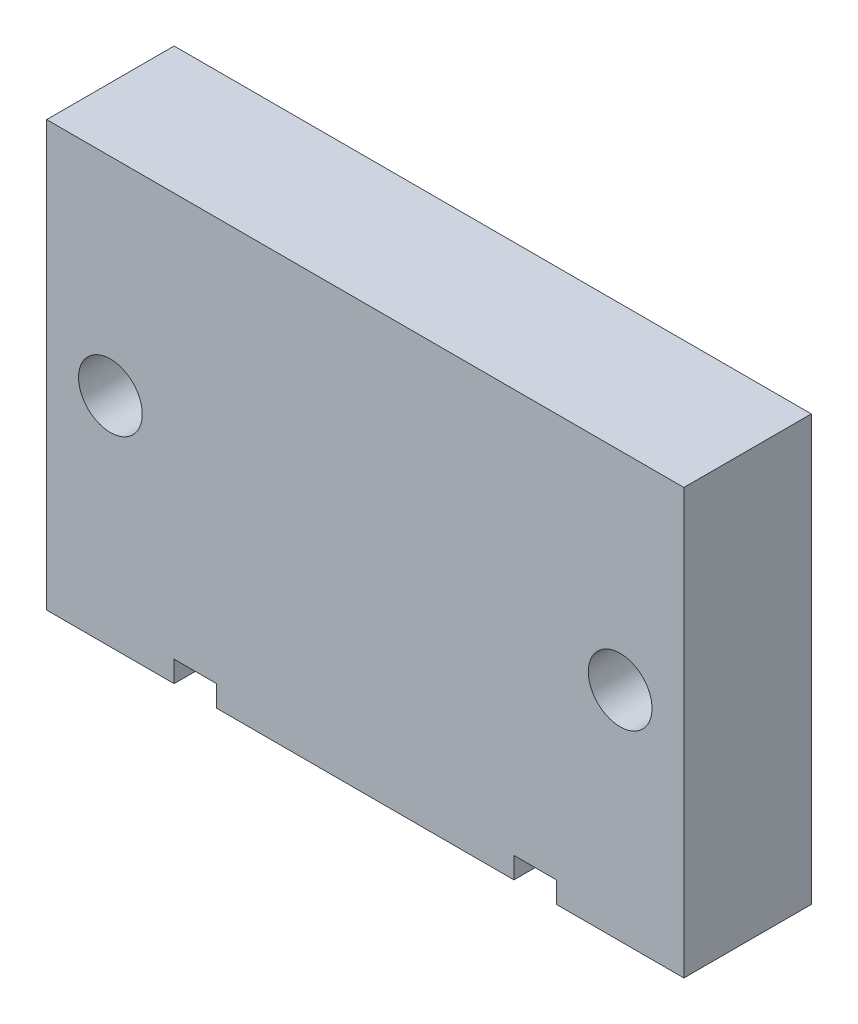
ISO-10303-21;
HEADER;
FILE_DESCRIPTION(('STEP AP214'),'2;1');
FILE_NAME('part.step','',(''),(''),'','','');
FILE_SCHEMA(('AUTOMOTIVE_DESIGN { 1 0 10303 214 1 1 1 1 }'));
ENDSEC;
DATA;
#1=APPLICATION_CONTEXT('core data for automotive mechanical design processes');
#2=APPLICATION_PROTOCOL_DEFINITION('international standard','automotive_design',2000,#1);
#3=PRODUCT_CONTEXT('',#1,'mechanical');
#4=PRODUCT('Part','Part','',(#3));
#5=PRODUCT_RELATED_PRODUCT_CATEGORY('part','',(#4));
#6=PRODUCT_DEFINITION_FORMATION('','',#4);
#7=PRODUCT_DEFINITION_CONTEXT('part definition',#1,'design');
#8=PRODUCT_DEFINITION('design','',#6,#7);
#9=PRODUCT_DEFINITION_SHAPE('','',#8);
#10=(LENGTH_UNIT() NAMED_UNIT(*) SI_UNIT(.MILLI.,.METRE.));
#11=(NAMED_UNIT(*) PLANE_ANGLE_UNIT() SI_UNIT($,.RADIAN.));
#12=(NAMED_UNIT(*) SI_UNIT($,.STERADIAN.) SOLID_ANGLE_UNIT());
#13=UNCERTAINTY_MEASURE_WITH_UNIT(LENGTH_MEASURE(1.E-05),#10,'distance_accuracy_value','');
#14=(GEOMETRIC_REPRESENTATION_CONTEXT(3) GLOBAL_UNCERTAINTY_ASSIGNED_CONTEXT((#13)) GLOBAL_UNIT_ASSIGNED_CONTEXT((#10,
#11,#12)) REPRESENTATION_CONTEXT('',''));
#15=CARTESIAN_POINT('',(0.,0.,0.));
#16=DIRECTION('',(0.,0.,1.));
#17=DIRECTION('',(1.,0.,0.));
#18=AXIS2_PLACEMENT_3D('',#15,#16,#17);
#19=CARTESIAN_POINT('',(-7.5,0.,1.5));
#20=DIRECTION('',(0.,1.,0.));
#21=DIRECTION('',(0.,0.,1.));
#22=AXIS2_PLACEMENT_3D('',#19,#20,#21);
#23=PLANE('',#22);
#24=DIRECTION('',(0.,0.,1.));
#25=VECTOR('',#24,1.);
#26=CARTESIAN_POINT('',(-3.5,0.,1.5));
#27=LINE('',#26,#25);
#28=CARTESIAN_POINT('',(-3.5,0.,-1.5));
#29=VERTEX_POINT('',#28);
#30=CARTESIAN_POINT('',(-3.5,0.,1.5));
#31=VERTEX_POINT('',#30);
#32=EDGE_CURVE('E176',#29,#31,#27,.T.);
#33=ORIENTED_EDGE('',*,*,#32,.F.);
#34=DIRECTION('',(1.,0.,0.));
#35=VECTOR('',#34,1.);
#36=CARTESIAN_POINT('',(-7.5,0.,-1.5));
#37=LINE('',#36,#35);
#38=CARTESIAN_POINT('',(3.5,0.,-1.5));
#39=VERTEX_POINT('',#38);
#40=EDGE_CURVE('E341',#29,#39,#37,.T.);
#41=ORIENTED_EDGE('',*,*,#40,.T.);
#42=DIRECTION('',(0.,0.,-1.));
#43=VECTOR('',#42,1.);
#44=CARTESIAN_POINT('',(3.5,0.,1.5));
#45=LINE('',#44,#43);
#46=CARTESIAN_POINT('',(3.5,0.,1.5));
#47=VERTEX_POINT('',#46);
#48=EDGE_CURVE('E234',#47,#39,#45,.T.);
#49=ORIENTED_EDGE('',*,*,#48,.F.);
#50=DIRECTION('',(1.,0.,0.));
#51=VECTOR('',#50,1.);
#52=CARTESIAN_POINT('',(-7.5,0.,1.5));
#53=LINE('',#52,#51);
#54=EDGE_CURVE('E329',#31,#47,#53,.T.);
#55=ORIENTED_EDGE('',*,*,#54,.F.);
#56=EDGE_LOOP('',(#33,#41,#49,#55));
#57=FACE_BOUND('',#56,.T.);
#58=ADVANCED_FACE('F42',(#57),#23,.F.);
#59=DIRECTION('',(0.,0.,-1.));
#60=VECTOR('',#59,1.);
#61=CARTESIAN_POINT('',(-4.5,0.,1.5));
#62=LINE('',#61,#60);
#63=CARTESIAN_POINT('',(-4.5,0.,1.5));
#64=VERTEX_POINT('',#63);
#65=CARTESIAN_POINT('',(-4.5,0.,-1.5));
#66=VERTEX_POINT('',#65);
#67=EDGE_CURVE('E194',#64,#66,#62,.T.);
#68=ORIENTED_EDGE('',*,*,#67,.F.);
#69=CARTESIAN_POINT('',(-7.5,0.,1.5));
#70=VERTEX_POINT('',#69);
#71=EDGE_CURVE('E321',#70,#64,#53,.T.);
#72=ORIENTED_EDGE('',*,*,#71,.F.);
#73=DIRECTION('',(0.,0.,-1.));
#74=VECTOR('',#73,1.);
#75=CARTESIAN_POINT('',(-7.5,0.,1.5));
#76=LINE('',#75,#74);
#77=CARTESIAN_POINT('',(-7.5,0.,-1.5));
#78=VERTEX_POINT('',#77);
#79=EDGE_CURVE('E11',#70,#78,#76,.T.);
#80=ORIENTED_EDGE('',*,*,#79,.T.);
#81=EDGE_CURVE('E340',#78,#66,#37,.T.);
#82=ORIENTED_EDGE('',*,*,#81,.T.);
#83=EDGE_LOOP('',(#68,#72,#80,#82));
#84=FACE_BOUND('',#83,.T.);
#85=ADVANCED_FACE('F392',(#84),#23,.F.);
#86=DIRECTION('',(0.,0.,1.));
#87=VECTOR('',#86,1.);
#88=CARTESIAN_POINT('',(4.5,0.,1.5));
#89=LINE('',#88,#87);
#90=CARTESIAN_POINT('',(4.5,0.,-1.5));
#91=VERTEX_POINT('',#90);
#92=CARTESIAN_POINT('',(4.5,0.,1.5));
#93=VERTEX_POINT('',#92);
#94=EDGE_CURVE('E202',#91,#93,#89,.T.);
#95=ORIENTED_EDGE('',*,*,#94,.F.);
#96=CARTESIAN_POINT('',(7.5,0.,-1.5));
#97=VERTEX_POINT('',#96);
#98=EDGE_CURVE('E337',#91,#97,#37,.T.);
#99=ORIENTED_EDGE('',*,*,#98,.T.);
#100=DIRECTION('',(0.,0.,-1.));
#101=VECTOR('',#100,1.);
#102=CARTESIAN_POINT('',(7.5,0.,1.5));
#103=LINE('',#102,#101);
#104=CARTESIAN_POINT('',(7.5,0.,1.5));
#105=VERTEX_POINT('',#104);
#106=EDGE_CURVE('E52',#105,#97,#103,.T.);
#107=ORIENTED_EDGE('',*,*,#106,.F.);
#108=EDGE_CURVE('E318',#93,#105,#53,.T.);
#109=ORIENTED_EDGE('',*,*,#108,.F.);
#110=EDGE_LOOP('',(#95,#99,#107,#109));
#111=FACE_BOUND('',#110,.T.);
#112=ADVANCED_FACE('F394',(#111),#23,.F.);
#113=CARTESIAN_POINT('',(0.,0.,-1.5));
#114=DIRECTION('',(0.,0.,-1.));
#115=DIRECTION('',(-1.,0.,0.));
#116=AXIS2_PLACEMENT_3D('',#113,#114,#115);
#117=PLANE('',#116);
#118=CARTESIAN_POINT('',(6.,5.12,-1.5));
#119=DIRECTION('',(0.,0.,-1.));
#120=DIRECTION('',(-1.,0.,0.));
#121=AXIS2_PLACEMENT_3D('',#118,#119,#120);
#122=CIRCLE('',#121,0.749999999999998);
#123=CARTESIAN_POINT('',(5.25,5.12,-1.5));
#124=VERTEX_POINT('',#123);
#125=EDGE_CURVE('E560',#124,#124,#122,.T.);
#126=ORIENTED_EDGE('',*,*,#125,.F.);
#127=EDGE_LOOP('',(#126));
#128=FACE_BOUND('',#127,.T.);
#129=CARTESIAN_POINT('',(-6.,5.12,-1.5));
#130=DIRECTION('',(0.,0.,-1.));
#131=DIRECTION('',(-1.,0.,0.));
#132=AXIS2_PLACEMENT_3D('',#129,#130,#131);
#133=CIRCLE('',#132,0.749999999999998);
#134=CARTESIAN_POINT('',(-6.75,5.12,-1.5));
#135=VERTEX_POINT('',#134);
#136=EDGE_CURVE('E559',#135,#135,#133,.T.);
#137=ORIENTED_EDGE('',*,*,#136,.F.);
#138=EDGE_LOOP('',(#137));
#139=FACE_BOUND('',#138,.T.);
#140=DIRECTION('',(0.5,0.866025403784438,0.));
#141=VECTOR('',#140,1.);
#142=CARTESIAN_POINT('',(1.64544826719043,2.27,-1.5));
#143=LINE('',#142,#141);
#144=CARTESIAN_POINT('',(1.64544826719043,2.27,-1.5));
#145=VERTEX_POINT('',#144);
#146=CARTESIAN_POINT('',(3.29089653438087,5.12,-1.5));
#147=VERTEX_POINT('',#146);
#148=EDGE_CURVE('E271',#145,#147,#143,.T.);
#149=ORIENTED_EDGE('',*,*,#148,.T.);
#150=DIRECTION('',(-0.5,0.866025403784439,0.));
#151=VECTOR('',#150,1.);
#152=CARTESIAN_POINT('',(3.29089653438087,5.12,-1.5));
#153=LINE('',#152,#151);
#154=CARTESIAN_POINT('',(1.64544826719043,7.97,-1.5));
#155=VERTEX_POINT('',#154);
#156=EDGE_CURVE('E276',#147,#155,#153,.T.);
#157=ORIENTED_EDGE('',*,*,#156,.T.);
#158=DIRECTION('',(-1.,0.,0.));
#159=VECTOR('',#158,1.);
#160=CARTESIAN_POINT('',(1.64544826719043,7.97,-1.5));
#161=LINE('',#160,#159);
#162=CARTESIAN_POINT('',(-1.64544826719043,7.97,-1.5));
#163=VERTEX_POINT('',#162);
#164=EDGE_CURVE('E284',#155,#163,#161,.T.);
#165=ORIENTED_EDGE('',*,*,#164,.T.);
#166=DIRECTION('',(-0.5,-0.866025403784439,0.));
#167=VECTOR('',#166,1.);
#168=CARTESIAN_POINT('',(-1.64544826719043,7.97,-1.5));
#169=LINE('',#168,#167);
#170=CARTESIAN_POINT('',(-3.29089653438087,5.12,-1.5));
#171=VERTEX_POINT('',#170);
#172=EDGE_CURVE('E282',#163,#171,#169,.T.);
#173=ORIENTED_EDGE('',*,*,#172,.T.);
#174=DIRECTION('',(0.5,-0.866025403784439,0.));
#175=VECTOR('',#174,1.);
#176=CARTESIAN_POINT('',(-3.29089653438087,5.12,-1.5));
#177=LINE('',#176,#175);
#178=CARTESIAN_POINT('',(-1.64544826719043,2.27,-1.5));
#179=VERTEX_POINT('',#178);
#180=EDGE_CURVE('E288',#171,#179,#177,.T.);
#181=ORIENTED_EDGE('',*,*,#180,.T.);
#182=DIRECTION('',(1.,0.,0.));
#183=VECTOR('',#182,1.);
#184=CARTESIAN_POINT('',(-1.64544826719043,2.27,-1.5));
#185=LINE('',#184,#183);
#186=EDGE_CURVE('E291',#179,#145,#185,.T.);
#187=ORIENTED_EDGE('',*,*,#186,.T.);
#188=EDGE_LOOP('',(#149,#157,#165,#173,#181,#187));
#189=FACE_BOUND('',#188,.T.);
#190=DIRECTION('',(1.,0.,0.));
#191=VECTOR('',#190,1.);
#192=CARTESIAN_POINT('',(-3.5,0.5,-1.5));
#193=LINE('',#192,#191);
#194=CARTESIAN_POINT('',(-4.5,0.5,-1.5));
#195=VERTEX_POINT('',#194);
#196=CARTESIAN_POINT('',(-3.5,0.5,-1.5));
#197=VERTEX_POINT('',#196);
#198=EDGE_CURVE('E182',#195,#197,#193,.T.);
#199=ORIENTED_EDGE('',*,*,#198,.F.);
#200=DIRECTION('',(0.,-1.,0.));
#201=VECTOR('',#200,1.);
#202=CARTESIAN_POINT('',(-4.5,0.5,-1.5));
#203=LINE('',#202,#201);
#204=EDGE_CURVE('E211',#195,#66,#203,.T.);
#205=ORIENTED_EDGE('',*,*,#204,.T.);
#206=ORIENTED_EDGE('',*,*,#81,.F.);
#207=DIRECTION('',(0.,-1.,0.));
#208=VECTOR('',#207,1.);
#209=CARTESIAN_POINT('',(-7.5,0.,-1.5));
#210=LINE('',#209,#208);
#211=CARTESIAN_POINT('',(-7.5,10.,-1.5));
#212=VERTEX_POINT('',#211);
#213=EDGE_CURVE('E301',#212,#78,#210,.T.);
#214=ORIENTED_EDGE('',*,*,#213,.F.);
#215=DIRECTION('',(-1.,0.,0.));
#216=VECTOR('',#215,1.);
#217=CARTESIAN_POINT('',(-7.5,10.,-1.5));
#218=LINE('',#217,#216);
#219=CARTESIAN_POINT('',(7.5,10.,-1.5));
#220=VERTEX_POINT('',#219);
#221=EDGE_CURVE('E324',#220,#212,#218,.T.);
#222=ORIENTED_EDGE('',*,*,#221,.F.);
#223=DIRECTION('',(0.,1.,0.));
#224=VECTOR('',#223,1.);
#225=CARTESIAN_POINT('',(7.5,0.,-1.5));
#226=LINE('',#225,#224);
#227=EDGE_CURVE('E344',#97,#220,#226,.T.);
#228=ORIENTED_EDGE('',*,*,#227,.F.);
#229=ORIENTED_EDGE('',*,*,#98,.F.);
#230=DIRECTION('',(0.,-1.,0.));
#231=VECTOR('',#230,1.);
#232=CARTESIAN_POINT('',(4.5,0.5,-1.5));
#233=LINE('',#232,#231);
#234=CARTESIAN_POINT('',(4.5,0.5,-1.5));
#235=VERTEX_POINT('',#234);
#236=EDGE_CURVE('E229',#235,#91,#233,.T.);
#237=ORIENTED_EDGE('',*,*,#236,.F.);
#238=DIRECTION('',(1.,0.,0.));
#239=VECTOR('',#238,1.);
#240=CARTESIAN_POINT('',(4.5,0.5,-1.5));
#241=LINE('',#240,#239);
#242=CARTESIAN_POINT('',(3.5,0.5,-1.5));
#243=VERTEX_POINT('',#242);
#244=EDGE_CURVE('E221',#243,#235,#241,.T.);
#245=ORIENTED_EDGE('',*,*,#244,.F.);
#246=DIRECTION('',(0.,-1.,0.));
#247=VECTOR('',#246,1.);
#248=CARTESIAN_POINT('',(3.5,0.5,-1.5));
#249=LINE('',#248,#247);
#250=EDGE_CURVE('E228',#243,#39,#249,.T.);
#251=ORIENTED_EDGE('',*,*,#250,.T.);
#252=ORIENTED_EDGE('',*,*,#40,.F.);
#253=DIRECTION('',(0.,-1.,0.));
#254=VECTOR('',#253,1.);
#255=CARTESIAN_POINT('',(-3.5,0.5,-1.5));
#256=LINE('',#255,#254);
#257=EDGE_CURVE('E206',#197,#29,#256,.T.);
#258=ORIENTED_EDGE('',*,*,#257,.F.);
#259=EDGE_LOOP('',(#199,#205,#206,#214,#222,#228,#229,#237,#245,#251,#252,#258));
#260=FACE_BOUND('',#259,.T.);
#261=ADVANCED_FACE('F366',(#128,#139,#189,#260),#117,.T.);
#262=CARTESIAN_POINT('',(-7.5,0.,1.5));
#263=DIRECTION('',(1.,0.,0.));
#264=DIRECTION('',(0.,0.,-1.));
#265=AXIS2_PLACEMENT_3D('',#262,#263,#264);
#266=PLANE('',#265);
#267=ORIENTED_EDGE('',*,*,#213,.T.);
#268=ORIENTED_EDGE('',*,*,#79,.F.);
#269=DIRECTION('',(0.,-1.,0.));
#270=VECTOR('',#269,1.);
#271=CARTESIAN_POINT('',(-7.5,0.,1.5));
#272=LINE('',#271,#270);
#273=CARTESIAN_POINT('',(-7.5,10.,1.5));
#274=VERTEX_POINT('',#273);
#275=EDGE_CURVE('E317',#274,#70,#272,.T.);
#276=ORIENTED_EDGE('',*,*,#275,.F.);
#277=DIRECTION('',(0.,0.,-1.));
#278=VECTOR('',#277,1.);
#279=CARTESIAN_POINT('',(-7.5,10.,1.5));
#280=LINE('',#279,#278);
#281=EDGE_CURVE('E331',#274,#212,#280,.T.);
#282=ORIENTED_EDGE('',*,*,#281,.T.);
#283=EDGE_LOOP('',(#267,#268,#276,#282));
#284=FACE_BOUND('',#283,.T.);
#285=ADVANCED_FACE('F46',(#284),#266,.F.);
#286=CARTESIAN_POINT('',(7.5,0.,1.5));
#287=DIRECTION('',(-1.,0.,0.));
#288=DIRECTION('',(0.,0.,1.));
#289=AXIS2_PLACEMENT_3D('',#286,#287,#288);
#290=PLANE('',#289);
#291=ORIENTED_EDGE('',*,*,#227,.T.);
#292=DIRECTION('',(0.,0.,-1.));
#293=VECTOR('',#292,1.);
#294=CARTESIAN_POINT('',(7.5,10.,1.5));
#295=LINE('',#294,#293);
#296=CARTESIAN_POINT('',(7.5,10.,1.5));
#297=VERTEX_POINT('',#296);
#298=EDGE_CURVE('E347',#297,#220,#295,.T.);
#299=ORIENTED_EDGE('',*,*,#298,.F.);
#300=DIRECTION('',(0.,1.,0.));
#301=VECTOR('',#300,1.);
#302=CARTESIAN_POINT('',(7.5,0.,1.5));
#303=LINE('',#302,#301);
#304=EDGE_CURVE('E322',#105,#297,#303,.T.);
#305=ORIENTED_EDGE('',*,*,#304,.F.);
#306=ORIENTED_EDGE('',*,*,#106,.T.);
#307=EDGE_LOOP('',(#291,#299,#305,#306));
#308=FACE_BOUND('',#307,.T.);
#309=ADVANCED_FACE('F360',(#308),#290,.F.);
#310=CARTESIAN_POINT('',(-7.5,10.,1.5));
#311=DIRECTION('',(0.,-1.,0.));
#312=DIRECTION('',(0.,0.,-1.));
#313=AXIS2_PLACEMENT_3D('',#310,#311,#312);
#314=PLANE('',#313);
#315=ORIENTED_EDGE('',*,*,#221,.T.);
#316=ORIENTED_EDGE('',*,*,#281,.F.);
#317=DIRECTION('',(-1.,0.,0.));
#318=VECTOR('',#317,1.);
#319=CARTESIAN_POINT('',(-7.5,10.,1.5));
#320=LINE('',#319,#318);
#321=EDGE_CURVE('E328',#297,#274,#320,.T.);
#322=ORIENTED_EDGE('',*,*,#321,.F.);
#323=ORIENTED_EDGE('',*,*,#298,.T.);
#324=EDGE_LOOP('',(#315,#316,#322,#323));
#325=FACE_BOUND('',#324,.T.);
#326=ADVANCED_FACE('F371',(#325),#314,.F.);
#327=CARTESIAN_POINT('',(0.,0.,1.5));
#328=DIRECTION('',(0.,0.,-1.));
#329=DIRECTION('',(-1.,0.,0.));
#330=AXIS2_PLACEMENT_3D('',#327,#328,#329);
#331=PLANE('',#330);
#332=CARTESIAN_POINT('',(6.,5.12,1.5));
#333=DIRECTION('',(0.,0.,-1.));
#334=DIRECTION('',(-1.,0.,0.));
#335=AXIS2_PLACEMENT_3D('',#332,#333,#334);
#336=CIRCLE('',#335,0.749999999999998);
#337=CARTESIAN_POINT('',(5.25,5.12,1.5));
#338=VERTEX_POINT('',#337);
#339=EDGE_CURVE('E231',#338,#338,#336,.T.);
#340=ORIENTED_EDGE('',*,*,#339,.T.);
#341=EDGE_LOOP('',(#340));
#342=FACE_BOUND('',#341,.T.);
#343=CARTESIAN_POINT('',(-6.,5.12,1.5));
#344=DIRECTION('',(0.,0.,-1.));
#345=DIRECTION('',(-1.,0.,0.));
#346=AXIS2_PLACEMENT_3D('',#343,#344,#345);
#347=CIRCLE('',#346,0.749999999999998);
#348=CARTESIAN_POINT('',(-6.75,5.12,1.5));
#349=VERTEX_POINT('',#348);
#350=EDGE_CURVE('E564',#349,#349,#347,.T.);
#351=ORIENTED_EDGE('',*,*,#350,.T.);
#352=EDGE_LOOP('',(#351));
#353=FACE_BOUND('',#352,.T.);
#354=DIRECTION('',(-1.,0.,0.));
#355=VECTOR('',#354,1.);
#356=CARTESIAN_POINT('',(-3.5,0.5,1.5));
#357=LINE('',#356,#355);
#358=CARTESIAN_POINT('',(-3.5,0.5,1.5));
#359=VERTEX_POINT('',#358);
#360=CARTESIAN_POINT('',(-4.5,0.5,1.5));
#361=VERTEX_POINT('',#360);
#362=EDGE_CURVE('E187',#359,#361,#357,.T.);
#363=ORIENTED_EDGE('',*,*,#362,.F.);
#364=DIRECTION('',(0.,-1.,0.));
#365=VECTOR('',#364,1.);
#366=CARTESIAN_POINT('',(-3.5,0.5,1.5));
#367=LINE('',#366,#365);
#368=EDGE_CURVE('E171',#359,#31,#367,.T.);
#369=ORIENTED_EDGE('',*,*,#368,.T.);
#370=ORIENTED_EDGE('',*,*,#54,.T.);
#371=DIRECTION('',(0.,-1.,0.));
#372=VECTOR('',#371,1.);
#373=CARTESIAN_POINT('',(3.5,0.5,1.5));
#374=LINE('',#373,#372);
#375=CARTESIAN_POINT('',(3.5,0.5,1.5));
#376=VERTEX_POINT('',#375);
#377=EDGE_CURVE('E225',#376,#47,#374,.T.);
#378=ORIENTED_EDGE('',*,*,#377,.F.);
#379=DIRECTION('',(-1.,0.,0.));
#380=VECTOR('',#379,1.);
#381=CARTESIAN_POINT('',(4.5,0.5,1.5));
#382=LINE('',#381,#380);
#383=CARTESIAN_POINT('',(4.5,0.5,1.5));
#384=VERTEX_POINT('',#383);
#385=EDGE_CURVE('E242',#384,#376,#382,.T.);
#386=ORIENTED_EDGE('',*,*,#385,.F.);
#387=DIRECTION('',(0.,-1.,0.));
#388=VECTOR('',#387,1.);
#389=CARTESIAN_POINT('',(4.5,0.5,1.5));
#390=LINE('',#389,#388);
#391=EDGE_CURVE('E220',#384,#93,#390,.T.);
#392=ORIENTED_EDGE('',*,*,#391,.T.);
#393=ORIENTED_EDGE('',*,*,#108,.T.);
#394=ORIENTED_EDGE('',*,*,#304,.T.);
#395=ORIENTED_EDGE('',*,*,#321,.T.);
#396=ORIENTED_EDGE('',*,*,#275,.T.);
#397=ORIENTED_EDGE('',*,*,#71,.T.);
#398=DIRECTION('',(0.,-1.,0.));
#399=VECTOR('',#398,1.);
#400=CARTESIAN_POINT('',(-4.5,0.5,1.5));
#401=LINE('',#400,#399);
#402=EDGE_CURVE('E185',#361,#64,#401,.T.);
#403=ORIENTED_EDGE('',*,*,#402,.F.);
#404=EDGE_LOOP('',(#363,#369,#370,#378,#386,#392,#393,#394,#395,#396,#397,#403));
#405=FACE_BOUND('',#404,.T.);
#406=ADVANCED_FACE('F195',(#342,#353,#405),#331,.F.);
#407=CARTESIAN_POINT('',(1.64544826719043,2.27,-1.5));
#408=DIRECTION('',(0.866025403784439,-0.5,0.));
#409=DIRECTION('',(0.5,0.866025403784439,0.));
#410=AXIS2_PLACEMENT_3D('',#407,#408,#409);
#411=PLANE('',#410);
#412=DIRECTION('',(0.,0.,1.));
#413=VECTOR('',#412,1.);
#414=CARTESIAN_POINT('',(3.29089653438087,5.12,-1.5));
#415=LINE('',#414,#413);
#416=CARTESIAN_POINT('',(3.29089653438087,5.12,1.));
#417=VERTEX_POINT('',#416);
#418=EDGE_CURVE('E300',#147,#417,#415,.T.);
#419=ORIENTED_EDGE('',*,*,#418,.F.);
#420=ORIENTED_EDGE('',*,*,#148,.F.);
#421=DIRECTION('',(0.,0.,1.));
#422=VECTOR('',#421,1.);
#423=CARTESIAN_POINT('',(1.64544826719043,2.27,-1.5));
#424=LINE('',#423,#422);
#425=CARTESIAN_POINT('',(1.64544826719043,2.27,1.));
#426=VERTEX_POINT('',#425);
#427=EDGE_CURVE('E296',#145,#426,#424,.T.);
#428=ORIENTED_EDGE('',*,*,#427,.T.);
#429=DIRECTION('',(0.5,0.866025403784438,0.));
#430=VECTOR('',#429,1.);
#431=CARTESIAN_POINT('',(1.64544826719043,2.27,1.));
#432=LINE('',#431,#430);
#433=EDGE_CURVE('E214',#426,#417,#432,.T.);
#434=ORIENTED_EDGE('',*,*,#433,.T.);
#435=EDGE_LOOP('',(#419,#420,#428,#434));
#436=FACE_BOUND('',#435,.T.);
#437=ADVANCED_FACE('F487',(#436),#411,.F.);
#438=CARTESIAN_POINT('',(-1.64544826719043,2.27,-1.5));
#439=DIRECTION('',(0.,-1.,0.));
#440=DIRECTION('',(0.,0.,-1.));
#441=AXIS2_PLACEMENT_3D('',#438,#439,#440);
#442=PLANE('',#441);
#443=ORIENTED_EDGE('',*,*,#427,.F.);
#444=ORIENTED_EDGE('',*,*,#186,.F.);
#445=DIRECTION('',(0.,0.,1.));
#446=VECTOR('',#445,1.);
#447=CARTESIAN_POINT('',(-1.64544826719043,2.27,-1.5));
#448=LINE('',#447,#446);
#449=CARTESIAN_POINT('',(-1.64544826719043,2.27,1.));
#450=VERTEX_POINT('',#449);
#451=EDGE_CURVE('E305',#179,#450,#448,.T.);
#452=ORIENTED_EDGE('',*,*,#451,.T.);
#453=DIRECTION('',(1.,0.,0.));
#454=VECTOR('',#453,1.);
#455=CARTESIAN_POINT('',(-1.64544826719043,2.27,1.));
#456=LINE('',#455,#454);
#457=EDGE_CURVE('E268',#450,#426,#456,.T.);
#458=ORIENTED_EDGE('',*,*,#457,.T.);
#459=EDGE_LOOP('',(#443,#444,#452,#458));
#460=FACE_BOUND('',#459,.T.);
#461=ADVANCED_FACE('F476',(#460),#442,.F.);
#462=CARTESIAN_POINT('',(-3.29089653438087,5.12,-1.5));
#463=DIRECTION('',(-0.866025403784439,-0.5,0.));
#464=DIRECTION('',(0.5,-0.866025403784439,0.));
#465=AXIS2_PLACEMENT_3D('',#462,#463,#464);
#466=PLANE('',#465);
#467=ORIENTED_EDGE('',*,*,#451,.F.);
#468=ORIENTED_EDGE('',*,*,#180,.F.);
#469=DIRECTION('',(0.,0.,1.));
#470=VECTOR('',#469,1.);
#471=CARTESIAN_POINT('',(-3.29089653438087,5.12,-1.5));
#472=LINE('',#471,#470);
#473=CARTESIAN_POINT('',(-3.29089653438087,5.12,1.));
#474=VERTEX_POINT('',#473);
#475=EDGE_CURVE('E304',#171,#474,#472,.T.);
#476=ORIENTED_EDGE('',*,*,#475,.T.);
#477=DIRECTION('',(0.5,-0.866025403784439,0.));
#478=VECTOR('',#477,1.);
#479=CARTESIAN_POINT('',(-3.29089653438087,5.12,1.));
#480=LINE('',#479,#478);
#481=EDGE_CURVE('E262',#474,#450,#480,.T.);
#482=ORIENTED_EDGE('',*,*,#481,.T.);
#483=EDGE_LOOP('',(#467,#468,#476,#482));
#484=FACE_BOUND('',#483,.T.);
#485=ADVANCED_FACE('F470',(#484),#466,.F.);
#486=CARTESIAN_POINT('',(-1.64544826719043,7.97,-1.5));
#487=DIRECTION('',(-0.866025403784439,0.5,0.));
#488=DIRECTION('',(-0.5,-0.866025403784439,0.));
#489=AXIS2_PLACEMENT_3D('',#486,#487,#488);
#490=PLANE('',#489);
#491=ORIENTED_EDGE('',*,*,#475,.F.);
#492=ORIENTED_EDGE('',*,*,#172,.F.);
#493=DIRECTION('',(0.,0.,1.));
#494=VECTOR('',#493,1.);
#495=CARTESIAN_POINT('',(-1.64544826719043,7.97,-1.5));
#496=LINE('',#495,#494);
#497=CARTESIAN_POINT('',(-1.64544826719043,7.97,1.));
#498=VERTEX_POINT('',#497);
#499=EDGE_CURVE('E308',#163,#498,#496,.T.);
#500=ORIENTED_EDGE('',*,*,#499,.T.);
#501=DIRECTION('',(-0.5,-0.866025403784439,0.));
#502=VECTOR('',#501,1.);
#503=CARTESIAN_POINT('',(-1.64544826719043,7.97,1.));
#504=LINE('',#503,#502);
#505=EDGE_CURVE('E264',#498,#474,#504,.T.);
#506=ORIENTED_EDGE('',*,*,#505,.T.);
#507=EDGE_LOOP('',(#491,#492,#500,#506));
#508=FACE_BOUND('',#507,.T.);
#509=ADVANCED_FACE('F456',(#508),#490,.F.);
#510=CARTESIAN_POINT('',(1.64544826719043,7.97,-1.5));
#511=DIRECTION('',(0.,1.,0.));
#512=DIRECTION('',(0.,0.,1.));
#513=AXIS2_PLACEMENT_3D('',#510,#511,#512);
#514=PLANE('',#513);
#515=ORIENTED_EDGE('',*,*,#499,.F.);
#516=ORIENTED_EDGE('',*,*,#164,.F.);
#517=DIRECTION('',(0.,0.,1.));
#518=VECTOR('',#517,1.);
#519=CARTESIAN_POINT('',(1.64544826719043,7.97,-1.5));
#520=LINE('',#519,#518);
#521=CARTESIAN_POINT('',(1.64544826719043,7.97,1.));
#522=VERTEX_POINT('',#521);
#523=EDGE_CURVE('E311',#155,#522,#520,.T.);
#524=ORIENTED_EDGE('',*,*,#523,.T.);
#525=DIRECTION('',(-1.,0.,0.));
#526=VECTOR('',#525,1.);
#527=CARTESIAN_POINT('',(1.64544826719043,7.97,1.));
#528=LINE('',#527,#526);
#529=EDGE_CURVE('E256',#522,#498,#528,.T.);
#530=ORIENTED_EDGE('',*,*,#529,.T.);
#531=EDGE_LOOP('',(#515,#516,#524,#530));
#532=FACE_BOUND('',#531,.T.);
#533=ADVANCED_FACE('F450',(#532),#514,.F.);
#534=CARTESIAN_POINT('',(3.29089653438087,5.12,-1.5));
#535=DIRECTION('',(0.866025403784439,0.5,0.));
#536=DIRECTION('',(-0.5,0.866025403784439,0.));
#537=AXIS2_PLACEMENT_3D('',#534,#535,#536);
#538=PLANE('',#537);
#539=ORIENTED_EDGE('',*,*,#523,.F.);
#540=ORIENTED_EDGE('',*,*,#156,.F.);
#541=ORIENTED_EDGE('',*,*,#418,.T.);
#542=DIRECTION('',(-0.5,0.866025403784439,0.));
#543=VECTOR('',#542,1.);
#544=CARTESIAN_POINT('',(3.29089653438087,5.12,1.));
#545=LINE('',#544,#543);
#546=EDGE_CURVE('E254',#417,#522,#545,.T.);
#547=ORIENTED_EDGE('',*,*,#546,.T.);
#548=EDGE_LOOP('',(#539,#540,#541,#547));
#549=FACE_BOUND('',#548,.T.);
#550=ADVANCED_FACE('F437',(#549),#538,.F.);
#551=CARTESIAN_POINT('',(0.,0.,1.));
#552=DIRECTION('',(0.,0.,1.));
#553=DIRECTION('',(1.,0.,0.));
#554=AXIS2_PLACEMENT_3D('',#551,#552,#553);
#555=PLANE('',#554);
#556=ORIENTED_EDGE('',*,*,#433,.F.);
#557=ORIENTED_EDGE('',*,*,#457,.F.);
#558=ORIENTED_EDGE('',*,*,#481,.F.);
#559=ORIENTED_EDGE('',*,*,#505,.F.);
#560=ORIENTED_EDGE('',*,*,#529,.F.);
#561=ORIENTED_EDGE('',*,*,#546,.F.);
#562=EDGE_LOOP('',(#556,#557,#558,#559,#560,#561));
#563=FACE_BOUND('',#562,.T.);
#564=ADVANCED_FACE('F413',(#563),#555,.F.);
#565=CARTESIAN_POINT('',(4.5,0.5,1.5));
#566=DIRECTION('',(1.,0.,0.));
#567=DIRECTION('',(0.,0.,-1.));
#568=AXIS2_PLACEMENT_3D('',#565,#566,#567);
#569=PLANE('',#568);
#570=ORIENTED_EDGE('',*,*,#94,.T.);
#571=ORIENTED_EDGE('',*,*,#391,.F.);
#572=DIRECTION('',(0.,0.,1.));
#573=VECTOR('',#572,1.);
#574=CARTESIAN_POINT('',(4.5,0.5,1.5));
#575=LINE('',#574,#573);
#576=EDGE_CURVE('E240',#235,#384,#575,.T.);
#577=ORIENTED_EDGE('',*,*,#576,.F.);
#578=ORIENTED_EDGE('',*,*,#236,.T.);
#579=EDGE_LOOP('',(#570,#571,#577,#578));
#580=FACE_BOUND('',#579,.T.);
#581=ADVANCED_FACE('F387',(#580),#569,.F.);
#582=CARTESIAN_POINT('',(3.5,0.5,1.5));
#583=DIRECTION('',(-1.,0.,0.));
#584=DIRECTION('',(0.,0.,1.));
#585=AXIS2_PLACEMENT_3D('',#582,#583,#584);
#586=PLANE('',#585);
#587=ORIENTED_EDGE('',*,*,#48,.T.);
#588=ORIENTED_EDGE('',*,*,#250,.F.);
#589=DIRECTION('',(0.,0.,-1.));
#590=VECTOR('',#589,1.);
#591=CARTESIAN_POINT('',(3.5,0.5,1.5));
#592=LINE('',#591,#590);
#593=EDGE_CURVE('E70',#376,#243,#592,.T.);
#594=ORIENTED_EDGE('',*,*,#593,.F.);
#595=ORIENTED_EDGE('',*,*,#377,.T.);
#596=EDGE_LOOP('',(#587,#588,#594,#595));
#597=FACE_BOUND('',#596,.T.);
#598=ADVANCED_FACE('F389',(#597),#586,.F.);
#599=CARTESIAN_POINT('',(0.,0.5,0.));
#600=DIRECTION('',(0.,1.,0.));
#601=DIRECTION('',(0.,0.,1.));
#602=AXIS2_PLACEMENT_3D('',#599,#600,#601);
#603=PLANE('',#602);
#604=ORIENTED_EDGE('',*,*,#576,.T.);
#605=ORIENTED_EDGE('',*,*,#385,.T.);
#606=ORIENTED_EDGE('',*,*,#593,.T.);
#607=ORIENTED_EDGE('',*,*,#244,.T.);
#608=EDGE_LOOP('',(#604,#605,#606,#607));
#609=FACE_BOUND('',#608,.T.);
#610=ADVANCED_FACE('F390',(#609),#603,.F.);
#611=CARTESIAN_POINT('',(-3.5,0.5,1.5));
#612=DIRECTION('',(1.,0.,0.));
#613=DIRECTION('',(0.,0.,-1.));
#614=AXIS2_PLACEMENT_3D('',#611,#612,#613);
#615=PLANE('',#614);
#616=ORIENTED_EDGE('',*,*,#32,.T.);
#617=ORIENTED_EDGE('',*,*,#368,.F.);
#618=DIRECTION('',(0.,0.,1.));
#619=VECTOR('',#618,1.);
#620=CARTESIAN_POINT('',(-3.5,0.5,1.5));
#621=LINE('',#620,#619);
#622=EDGE_CURVE('E172',#197,#359,#621,.T.);
#623=ORIENTED_EDGE('',*,*,#622,.F.);
#624=ORIENTED_EDGE('',*,*,#257,.T.);
#625=EDGE_LOOP('',(#616,#617,#623,#624));
#626=FACE_BOUND('',#625,.T.);
#627=ADVANCED_FACE('F173',(#626),#615,.F.);
#628=CARTESIAN_POINT('',(-4.5,0.5,1.5));
#629=DIRECTION('',(-1.,0.,0.));
#630=DIRECTION('',(0.,0.,1.));
#631=AXIS2_PLACEMENT_3D('',#628,#629,#630);
#632=PLANE('',#631);
#633=ORIENTED_EDGE('',*,*,#67,.T.);
#634=ORIENTED_EDGE('',*,*,#204,.F.);
#635=DIRECTION('',(0.,0.,-1.));
#636=VECTOR('',#635,1.);
#637=CARTESIAN_POINT('',(-4.5,0.5,1.5));
#638=LINE('',#637,#636);
#639=EDGE_CURVE('E58',#361,#195,#638,.T.);
#640=ORIENTED_EDGE('',*,*,#639,.F.);
#641=ORIENTED_EDGE('',*,*,#402,.T.);
#642=EDGE_LOOP('',(#633,#634,#640,#641));
#643=FACE_BOUND('',#642,.T.);
#644=ADVANCED_FACE('F538',(#643),#632,.F.);
#645=CARTESIAN_POINT('',(0.,0.5,0.));
#646=DIRECTION('',(0.,1.,0.));
#647=DIRECTION('',(0.,0.,1.));
#648=AXIS2_PLACEMENT_3D('',#645,#646,#647);
#649=PLANE('',#648);
#650=ORIENTED_EDGE('',*,*,#622,.T.);
#651=ORIENTED_EDGE('',*,*,#362,.T.);
#652=ORIENTED_EDGE('',*,*,#639,.T.);
#653=ORIENTED_EDGE('',*,*,#198,.T.);
#654=EDGE_LOOP('',(#650,#651,#652,#653));
#655=FACE_BOUND('',#654,.T.);
#656=ADVANCED_FACE('F184',(#655),#649,.F.);
#657=CARTESIAN_POINT('',(-6.,5.12,1.5));
#658=DIRECTION('',(0.,0.,-1.));
#659=DIRECTION('',(-1.,0.,0.));
#660=AXIS2_PLACEMENT_3D('',#657,#658,#659);
#661=CYLINDRICAL_SURFACE('',#660,0.749999999999998);
#662=ORIENTED_EDGE('',*,*,#350,.F.);
#663=EDGE_LOOP('',(#662));
#664=FACE_BOUND('',#663,.T.);
#665=ORIENTED_EDGE('',*,*,#136,.T.);
#666=EDGE_LOOP('',(#665));
#667=FACE_BOUND('',#666,.T.);
#668=ADVANCED_FACE('F543',(#664,#667),#661,.F.);
#669=CARTESIAN_POINT('',(6.,5.12,1.5));
#670=DIRECTION('',(0.,0.,-1.));
#671=DIRECTION('',(-1.,0.,0.));
#672=AXIS2_PLACEMENT_3D('',#669,#670,#671);
#673=CYLINDRICAL_SURFACE('',#672,0.749999999999998);
#674=ORIENTED_EDGE('',*,*,#339,.F.);
#675=EDGE_LOOP('',(#674));
#676=FACE_BOUND('',#675,.T.);
#677=ORIENTED_EDGE('',*,*,#125,.T.);
#678=EDGE_LOOP('',(#677));
#679=FACE_BOUND('',#678,.T.);
#680=ADVANCED_FACE('F549',(#676,#679),#673,.F.);
#681=CLOSED_SHELL('',(#58,#85,#112,#261,#285,#309,#326,#406,#437,#461,#485,#509,#533,#550,#564,
#581,#598,#610,#627,#644,#656,#668,#680));
#682=MANIFOLD_SOLID_BREP('B2',#681);
#683=ADVANCED_BREP_SHAPE_REPRESENTATION('',(#18,#682),#14);
#684=SHAPE_DEFINITION_REPRESENTATION(#9,#683);
ENDSEC;
END-ISO-10303-21;
